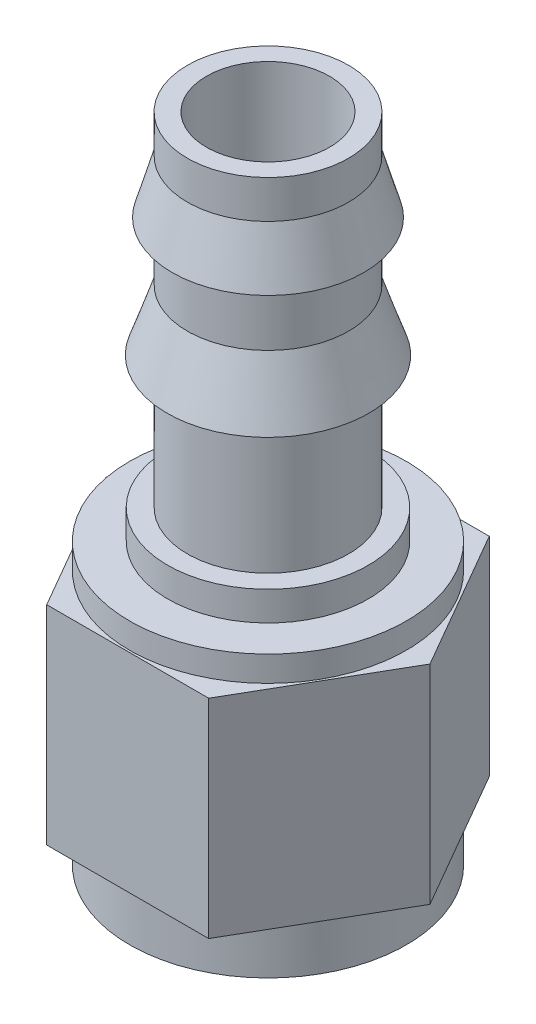
ISO-10303-21;
HEADER;
FILE_DESCRIPTION(('STEP AP214'),'2;1');
FILE_NAME('part.step','',(''),(''),'','','');
FILE_SCHEMA(('AUTOMOTIVE_DESIGN { 1 0 10303 214 1 1 1 1 }'));
ENDSEC;
DATA;
#1=APPLICATION_CONTEXT('core data for automotive mechanical design processes');
#2=APPLICATION_PROTOCOL_DEFINITION('international standard','automotive_design',2000,#1);
#3=PRODUCT_CONTEXT('',#1,'mechanical');
#4=PRODUCT('Part','Part','',(#3));
#5=PRODUCT_RELATED_PRODUCT_CATEGORY('part','',(#4));
#6=PRODUCT_DEFINITION_FORMATION('','',#4);
#7=PRODUCT_DEFINITION_CONTEXT('part definition',#1,'design');
#8=PRODUCT_DEFINITION('design','',#6,#7);
#9=PRODUCT_DEFINITION_SHAPE('','',#8);
#10=(LENGTH_UNIT() NAMED_UNIT(*) SI_UNIT(.MILLI.,.METRE.));
#11=(NAMED_UNIT(*) PLANE_ANGLE_UNIT() SI_UNIT($,.RADIAN.));
#12=(NAMED_UNIT(*) SI_UNIT($,.STERADIAN.) SOLID_ANGLE_UNIT());
#13=UNCERTAINTY_MEASURE_WITH_UNIT(LENGTH_MEASURE(1.E-05),#10,'distance_accuracy_value','');
#14=(GEOMETRIC_REPRESENTATION_CONTEXT(3) GLOBAL_UNCERTAINTY_ASSIGNED_CONTEXT((#13)) GLOBAL_UNIT_ASSIGNED_CONTEXT((#10,
#11,#12)) REPRESENTATION_CONTEXT('',''));
#15=CARTESIAN_POINT('',(0.,0.,0.));
#16=DIRECTION('',(0.,0.,1.));
#17=DIRECTION('',(1.,0.,0.));
#18=AXIS2_PLACEMENT_3D('',#15,#16,#17);
#19=CARTESIAN_POINT('',(11.05,20.1,0.));
#20=DIRECTION('',(0.,-1.,0.));
#21=DIRECTION('',(1.,0.,0.));
#22=AXIS2_PLACEMENT_3D('',#19,#20,#21);
#23=PLANE('',#22);
#24=CARTESIAN_POINT('',(0.,20.1,0.));
#25=DIRECTION('',(0.,1.,0.));
#26=DIRECTION('',(-1.,0.,0.));
#27=AXIS2_PLACEMENT_3D('',#24,#25,#26);
#28=CIRCLE('',#27,10.9);
#29=CARTESIAN_POINT('',(-10.9,20.1,0.));
#30=VERTEX_POINT('',#29);
#31=EDGE_CURVE('E179',#30,#30,#28,.T.);
#32=ORIENTED_EDGE('',*,*,#31,.F.);
#33=EDGE_LOOP('',(#32));
#34=FACE_BOUND('',#33,.T.);
#35=DIRECTION('',(0.499999999999995,0.,-0.866025403784442));
#36=VECTOR('',#35,1.);
#37=CARTESIAN_POINT('',(6.38090693661316,20.1,11.0520550125824));
#38=LINE('',#37,#36);
#39=CARTESIAN_POINT('',(6.38090693661316,20.1,11.0520550125824));
#40=VERTEX_POINT('',#39);
#41=CARTESIAN_POINT('',(12.7618138732261,20.1,0.));
#42=VERTEX_POINT('',#41);
#43=EDGE_CURVE('E123',#40,#42,#38,.T.);
#44=ORIENTED_EDGE('',*,*,#43,.T.);
#45=DIRECTION('',(-0.500000000000001,0.,-0.866025403784438));
#46=VECTOR('',#45,1.);
#47=CARTESIAN_POINT('',(12.7618138732261,20.1,0.));
#48=LINE('',#47,#46);
#49=CARTESIAN_POINT('',(6.380906936613,20.1,-11.0520550125825));
#50=VERTEX_POINT('',#49);
#51=EDGE_CURVE('E126',#42,#50,#48,.T.);
#52=ORIENTED_EDGE('',*,*,#51,.T.);
#53=DIRECTION('',(-1.,0.,0.));
#54=VECTOR('',#53,1.);
#55=CARTESIAN_POINT('',(6.380906936613,20.1,-11.0520550125825));
#56=LINE('',#55,#54);
#57=CARTESIAN_POINT('',(-6.38090693661308,20.1,-11.0520550125824));
#58=VERTEX_POINT('',#57);
#59=EDGE_CURVE('E130',#50,#58,#56,.T.);
#60=ORIENTED_EDGE('',*,*,#59,.T.);
#61=DIRECTION('',(-0.499999999999995,0.,0.866025403784442));
#62=VECTOR('',#61,1.);
#63=CARTESIAN_POINT('',(-6.38090693661308,20.1,-11.0520550125824));
#64=LINE('',#63,#62);
#65=CARTESIAN_POINT('',(-12.7618138732261,20.1,0.));
#66=VERTEX_POINT('',#65);
#67=EDGE_CURVE('E133',#58,#66,#64,.T.);
#68=ORIENTED_EDGE('',*,*,#67,.T.);
#69=DIRECTION('',(0.500000000000007,0.,0.866025403784435));
#70=VECTOR('',#69,1.);
#71=CARTESIAN_POINT('',(-12.7618138732261,20.1,0.));
#72=LINE('',#71,#70);
#73=CARTESIAN_POINT('',(-6.38090693661293,20.1,11.0520550125825));
#74=VERTEX_POINT('',#73);
#75=EDGE_CURVE('E99',#66,#74,#72,.T.);
#76=ORIENTED_EDGE('',*,*,#75,.T.);
#77=DIRECTION('',(1.,0.,0.));
#78=VECTOR('',#77,1.);
#79=CARTESIAN_POINT('',(-6.38090693661293,20.1,11.0520550125825));
#80=LINE('',#79,#78);
#81=EDGE_CURVE('E136',#74,#40,#80,.T.);
#82=ORIENTED_EDGE('',*,*,#81,.T.);
#83=EDGE_LOOP('',(#44,#52,#60,#68,#76,#82));
#84=FACE_BOUND('',#83,.T.);
#85=ADVANCED_FACE('F34',(#34,#84),#23,.F.);
#86=CARTESIAN_POINT('',(0.,51.4,0.));
#87=DIRECTION('',(0.,1.,0.));
#88=DIRECTION('',(-1.,0.,0.));
#89=AXIS2_PLACEMENT_3D('',#86,#87,#88);
#90=CYLINDRICAL_SURFACE('',#89,10.9);
#91=CARTESIAN_POINT('',(0.,22.1,0.));
#92=DIRECTION('',(0.,1.,0.));
#93=DIRECTION('',(-1.,0.,0.));
#94=AXIS2_PLACEMENT_3D('',#91,#92,#93);
#95=CIRCLE('',#94,10.9);
#96=CARTESIAN_POINT('',(-10.9,22.1,0.));
#97=VERTEX_POINT('',#96);
#98=EDGE_CURVE('E176',#97,#97,#95,.T.);
#99=ORIENTED_EDGE('',*,*,#98,.F.);
#100=EDGE_LOOP('',(#99));
#101=FACE_BOUND('',#100,.T.);
#102=ORIENTED_EDGE('',*,*,#31,.T.);
#103=EDGE_LOOP('',(#102));
#104=FACE_BOUND('',#103,.T.);
#105=ADVANCED_FACE('F199',(#101,#104),#90,.T.);
#106=CARTESIAN_POINT('',(10.9,22.1,0.));
#107=DIRECTION('',(0.,-1.,0.));
#108=DIRECTION('',(1.,0.,0.));
#109=AXIS2_PLACEMENT_3D('',#106,#107,#108);
#110=PLANE('',#109);
#111=CARTESIAN_POINT('',(0.,22.1,0.));
#112=DIRECTION('',(0.,1.,0.));
#113=DIRECTION('',(-1.,0.,0.));
#114=AXIS2_PLACEMENT_3D('',#111,#112,#113);
#115=CIRCLE('',#114,7.9);
#116=CARTESIAN_POINT('',(-7.9,22.1,0.));
#117=VERTEX_POINT('',#116);
#118=EDGE_CURVE('E173',#117,#117,#115,.T.);
#119=ORIENTED_EDGE('',*,*,#118,.F.);
#120=EDGE_LOOP('',(#119));
#121=FACE_BOUND('',#120,.T.);
#122=ORIENTED_EDGE('',*,*,#98,.T.);
#123=EDGE_LOOP('',(#122));
#124=FACE_BOUND('',#123,.T.);
#125=ADVANCED_FACE('F205',(#121,#124),#110,.F.);
#126=CARTESIAN_POINT('',(0.,51.4,0.));
#127=DIRECTION('',(0.,1.,0.));
#128=DIRECTION('',(-1.,0.,0.));
#129=AXIS2_PLACEMENT_3D('',#126,#127,#128);
#130=CYLINDRICAL_SURFACE('',#129,7.9);
#131=CARTESIAN_POINT('',(0.,24.4,0.));
#132=DIRECTION('',(0.,1.,0.));
#133=DIRECTION('',(-1.,0.,0.));
#134=AXIS2_PLACEMENT_3D('',#131,#132,#133);
#135=CIRCLE('',#134,7.9);
#136=CARTESIAN_POINT('',(-7.9,24.4,0.));
#137=VERTEX_POINT('',#136);
#138=EDGE_CURVE('E170',#137,#137,#135,.T.);
#139=ORIENTED_EDGE('',*,*,#138,.F.);
#140=EDGE_LOOP('',(#139));
#141=FACE_BOUND('',#140,.T.);
#142=ORIENTED_EDGE('',*,*,#118,.T.);
#143=EDGE_LOOP('',(#142));
#144=FACE_BOUND('',#143,.T.);
#145=ADVANCED_FACE('F213',(#141,#144),#130,.T.);
#146=CARTESIAN_POINT('',(7.9,24.4,0.));
#147=DIRECTION('',(0.,-1.,0.));
#148=DIRECTION('',(1.,0.,0.));
#149=AXIS2_PLACEMENT_3D('',#146,#147,#148);
#150=PLANE('',#149);
#151=CARTESIAN_POINT('',(0.,24.4,0.));
#152=DIRECTION('',(0.,1.,0.));
#153=DIRECTION('',(-1.,0.,0.));
#154=AXIS2_PLACEMENT_3D('',#151,#152,#153);
#155=CIRCLE('',#154,6.35);
#156=CARTESIAN_POINT('',(-6.35,24.4,0.));
#157=VERTEX_POINT('',#156);
#158=EDGE_CURVE('E167',#157,#157,#155,.T.);
#159=ORIENTED_EDGE('',*,*,#158,.F.);
#160=EDGE_LOOP('',(#159));
#161=FACE_BOUND('',#160,.T.);
#162=ORIENTED_EDGE('',*,*,#138,.T.);
#163=EDGE_LOOP('',(#162));
#164=FACE_BOUND('',#163,.T.);
#165=ADVANCED_FACE('F217',(#161,#164),#150,.F.);
#166=CARTESIAN_POINT('',(0.,51.4,0.));
#167=DIRECTION('',(0.,1.,0.));
#168=DIRECTION('',(-1.,0.,0.));
#169=AXIS2_PLACEMENT_3D('',#166,#167,#168);
#170=CYLINDRICAL_SURFACE('',#169,6.35);
#171=CARTESIAN_POINT('',(0.,34.8,0.));
#172=DIRECTION('',(0.,1.,0.));
#173=DIRECTION('',(-1.,0.,0.));
#174=AXIS2_PLACEMENT_3D('',#171,#172,#173);
#175=CIRCLE('',#174,6.35);
#176=CARTESIAN_POINT('',(-6.35,34.8,0.));
#177=VERTEX_POINT('',#176);
#178=EDGE_CURVE('E164',#177,#177,#175,.T.);
#179=ORIENTED_EDGE('',*,*,#178,.F.);
#180=EDGE_LOOP('',(#179));
#181=FACE_BOUND('',#180,.T.);
#182=ORIENTED_EDGE('',*,*,#158,.T.);
#183=EDGE_LOOP('',(#182));
#184=FACE_BOUND('',#183,.T.);
#185=ADVANCED_FACE('F221',(#181,#184),#170,.T.);
#186=CARTESIAN_POINT('',(6.35,34.8,0.));
#187=DIRECTION('',(0.,1.,0.));
#188=DIRECTION('',(-1.,0.,0.));
#189=AXIS2_PLACEMENT_3D('',#186,#187,#188);
#190=PLANE('',#189);
#191=CARTESIAN_POINT('',(0.,34.8,0.));
#192=DIRECTION('',(0.,1.,0.));
#193=DIRECTION('',(-1.,0.,0.));
#194=AXIS2_PLACEMENT_3D('',#191,#192,#193);
#195=CIRCLE('',#194,7.95);
#196=CARTESIAN_POINT('',(-7.95,34.8,0.));
#197=VERTEX_POINT('',#196);
#198=EDGE_CURVE('E161',#197,#197,#195,.T.);
#199=ORIENTED_EDGE('',*,*,#198,.F.);
#200=EDGE_LOOP('',(#199));
#201=FACE_BOUND('',#200,.T.);
#202=ORIENTED_EDGE('',*,*,#178,.T.);
#203=EDGE_LOOP('',(#202));
#204=FACE_BOUND('',#203,.T.);
#205=ADVANCED_FACE('F225',(#201,#204),#190,.F.);
#206=CARTESIAN_POINT('',(0.,34.8,0.));
#207=DIRECTION('',(0.,-1.,0.));
#208=DIRECTION('',(1.,0.,0.));
#209=AXIS2_PLACEMENT_3D('',#206,#207,#208);
#210=CONICAL_SURFACE('',#209,7.95,0.321750554396642);
#211=CARTESIAN_POINT('',(0.,39.6,0.));
#212=DIRECTION('',(0.,1.,0.));
#213=DIRECTION('',(-1.,0.,0.));
#214=AXIS2_PLACEMENT_3D('',#211,#212,#213);
#215=CIRCLE('',#214,6.35);
#216=CARTESIAN_POINT('',(-6.35,39.6,0.));
#217=VERTEX_POINT('',#216);
#218=EDGE_CURVE('E158',#217,#217,#215,.T.);
#219=ORIENTED_EDGE('',*,*,#218,.F.);
#220=EDGE_LOOP('',(#219));
#221=FACE_BOUND('',#220,.T.);
#222=ORIENTED_EDGE('',*,*,#198,.T.);
#223=EDGE_LOOP('',(#222));
#224=FACE_BOUND('',#223,.T.);
#225=ADVANCED_FACE('F229',(#221,#224),#210,.T.);
#226=CARTESIAN_POINT('',(0.,51.4,0.));
#227=DIRECTION('',(0.,1.,0.));
#228=DIRECTION('',(-1.,0.,0.));
#229=AXIS2_PLACEMENT_3D('',#226,#227,#228);
#230=CYLINDRICAL_SURFACE('',#229,6.35);
#231=CARTESIAN_POINT('',(0.,44.2,0.));
#232=DIRECTION('',(0.,1.,0.));
#233=DIRECTION('',(-1.,0.,0.));
#234=AXIS2_PLACEMENT_3D('',#231,#232,#233);
#235=CIRCLE('',#234,6.35);
#236=CARTESIAN_POINT('',(-6.35,44.2,0.));
#237=VERTEX_POINT('',#236);
#238=EDGE_CURVE('E155',#237,#237,#235,.T.);
#239=ORIENTED_EDGE('',*,*,#238,.F.);
#240=EDGE_LOOP('',(#239));
#241=FACE_BOUND('',#240,.T.);
#242=ORIENTED_EDGE('',*,*,#218,.T.);
#243=EDGE_LOOP('',(#242));
#244=FACE_BOUND('',#243,.T.);
#245=ADVANCED_FACE('F233',(#241,#244),#230,.T.);
#246=CARTESIAN_POINT('',(6.35,44.2,0.));
#247=DIRECTION('',(0.,1.,0.));
#248=DIRECTION('',(-1.,0.,0.));
#249=AXIS2_PLACEMENT_3D('',#246,#247,#248);
#250=PLANE('',#249);
#251=CARTESIAN_POINT('',(0.,44.2,0.));
#252=DIRECTION('',(0.,1.,0.));
#253=DIRECTION('',(-1.,0.,0.));
#254=AXIS2_PLACEMENT_3D('',#251,#252,#253);
#255=CIRCLE('',#254,7.55);
#256=CARTESIAN_POINT('',(-7.55,44.2,0.));
#257=VERTEX_POINT('',#256);
#258=EDGE_CURVE('E152',#257,#257,#255,.T.);
#259=ORIENTED_EDGE('',*,*,#258,.F.);
#260=EDGE_LOOP('',(#259));
#261=FACE_BOUND('',#260,.T.);
#262=ORIENTED_EDGE('',*,*,#238,.T.);
#263=EDGE_LOOP('',(#262));
#264=FACE_BOUND('',#263,.T.);
#265=ADVANCED_FACE('F237',(#261,#264),#250,.F.);
#266=CARTESIAN_POINT('',(0.,44.2,0.));
#267=DIRECTION('',(0.,-1.,0.));
#268=DIRECTION('',(1.,0.,0.));
#269=AXIS2_PLACEMENT_3D('',#266,#267,#268);
#270=CONICAL_SURFACE('',#269,7.55,0.278299659005111);
#271=CARTESIAN_POINT('',(0.,48.4,0.));
#272=DIRECTION('',(0.,1.,0.));
#273=DIRECTION('',(-1.,0.,0.));
#274=AXIS2_PLACEMENT_3D('',#271,#272,#273);
#275=CIRCLE('',#274,6.35);
#276=CARTESIAN_POINT('',(-6.35,48.4,0.));
#277=VERTEX_POINT('',#276);
#278=EDGE_CURVE('E149',#277,#277,#275,.T.);
#279=ORIENTED_EDGE('',*,*,#278,.F.);
#280=EDGE_LOOP('',(#279));
#281=FACE_BOUND('',#280,.T.);
#282=ORIENTED_EDGE('',*,*,#258,.T.);
#283=EDGE_LOOP('',(#282));
#284=FACE_BOUND('',#283,.T.);
#285=ADVANCED_FACE('F241',(#281,#284),#270,.T.);
#286=CARTESIAN_POINT('',(0.,51.4,0.));
#287=DIRECTION('',(0.,1.,0.));
#288=DIRECTION('',(-1.,0.,0.));
#289=AXIS2_PLACEMENT_3D('',#286,#287,#288);
#290=CYLINDRICAL_SURFACE('',#289,6.35);
#291=CARTESIAN_POINT('',(0.,51.4,0.));
#292=DIRECTION('',(0.,1.,0.));
#293=DIRECTION('',(-1.,0.,0.));
#294=AXIS2_PLACEMENT_3D('',#291,#292,#293);
#295=CIRCLE('',#294,6.35);
#296=CARTESIAN_POINT('',(-6.35,51.4,0.));
#297=VERTEX_POINT('',#296);
#298=EDGE_CURVE('E141',#297,#297,#295,.T.);
#299=ORIENTED_EDGE('',*,*,#298,.F.);
#300=EDGE_LOOP('',(#299));
#301=FACE_BOUND('',#300,.T.);
#302=ORIENTED_EDGE('',*,*,#278,.T.);
#303=EDGE_LOOP('',(#302));
#304=FACE_BOUND('',#303,.T.);
#305=ADVANCED_FACE('F245',(#301,#304),#290,.T.);
#306=CARTESIAN_POINT('',(0.,51.4,0.));
#307=DIRECTION('',(0.,-1.,0.));
#308=DIRECTION('',(1.,0.,0.));
#309=AXIS2_PLACEMENT_3D('',#306,#307,#308);
#310=PLANE('',#309);
#311=CARTESIAN_POINT('',(0.,51.4,0.));
#312=DIRECTION('',(0.,1.,0.));
#313=DIRECTION('',(-1.,0.,0.));
#314=AXIS2_PLACEMENT_3D('',#311,#312,#313);
#315=CIRCLE('',#314,4.85);
#316=CARTESIAN_POINT('',(-4.85,51.4,0.));
#317=VERTEX_POINT('',#316);
#318=EDGE_CURVE('E277',#317,#317,#315,.T.);
#319=ORIENTED_EDGE('',*,*,#318,.F.);
#320=EDGE_LOOP('',(#319));
#321=FACE_BOUND('',#320,.T.);
#322=ORIENTED_EDGE('',*,*,#298,.T.);
#323=EDGE_LOOP('',(#322));
#324=FACE_BOUND('',#323,.T.);
#325=ADVANCED_FACE('F249',(#321,#324),#310,.F.);
#326=CARTESIAN_POINT('',(0.,3.69999999999999,0.));
#327=DIRECTION('',(0.,1.,0.));
#328=DIRECTION('',(0.,0.,1.));
#329=AXIS2_PLACEMENT_3D('',#326,#327,#328);
#330=PLANE('',#329);
#331=DIRECTION('',(0.499999999999995,0.,-0.866025403784442));
#332=VECTOR('',#331,1.);
#333=CARTESIAN_POINT('',(6.38090693661316,3.69999999999999,11.0520550125824));
#334=LINE('',#333,#332);
#335=CARTESIAN_POINT('',(6.38090693661316,3.69999999999999,11.0520550125824));
#336=VERTEX_POINT('',#335);
#337=CARTESIAN_POINT('',(12.7618138732261,3.69999999999999,0.));
#338=VERTEX_POINT('',#337);
#339=EDGE_CURVE('E139',#336,#338,#334,.T.);
#340=ORIENTED_EDGE('',*,*,#339,.F.);
#341=DIRECTION('',(1.,0.,0.));
#342=VECTOR('',#341,1.);
#343=CARTESIAN_POINT('',(-6.38090693661293,3.69999999999999,11.0520550125825));
#344=LINE('',#343,#342);
#345=CARTESIAN_POINT('',(-6.38090693661293,3.69999999999999,11.0520550125825));
#346=VERTEX_POINT('',#345);
#347=EDGE_CURVE('E113',#346,#336,#344,.T.);
#348=ORIENTED_EDGE('',*,*,#347,.F.);
#349=DIRECTION('',(0.500000000000007,0.,0.866025403784435));
#350=VECTOR('',#349,1.);
#351=CARTESIAN_POINT('',(-12.7618138732261,3.69999999999999,0.));
#352=LINE('',#351,#350);
#353=CARTESIAN_POINT('',(-12.7618138732261,3.69999999999999,0.));
#354=VERTEX_POINT('',#353);
#355=EDGE_CURVE('E97',#354,#346,#352,.T.);
#356=ORIENTED_EDGE('',*,*,#355,.F.);
#357=DIRECTION('',(-0.499999999999995,0.,0.866025403784442));
#358=VECTOR('',#357,1.);
#359=CARTESIAN_POINT('',(-6.38090693661308,3.69999999999999,-11.0520550125824));
#360=LINE('',#359,#358);
#361=CARTESIAN_POINT('',(-6.38090693661308,3.69999999999999,-11.0520550125824));
#362=VERTEX_POINT('',#361);
#363=EDGE_CURVE('E111',#362,#354,#360,.T.);
#364=ORIENTED_EDGE('',*,*,#363,.F.);
#365=DIRECTION('',(-1.,0.,0.));
#366=VECTOR('',#365,1.);
#367=CARTESIAN_POINT('',(6.380906936613,3.69999999999999,-11.0520550125825));
#368=LINE('',#367,#366);
#369=CARTESIAN_POINT('',(6.380906936613,3.69999999999999,-11.0520550125825));
#370=VERTEX_POINT('',#369);
#371=EDGE_CURVE('E116',#370,#362,#368,.T.);
#372=ORIENTED_EDGE('',*,*,#371,.F.);
#373=DIRECTION('',(-0.500000000000001,0.,-0.866025403784438));
#374=VECTOR('',#373,1.);
#375=CARTESIAN_POINT('',(12.7618138732261,3.69999999999999,0.));
#376=LINE('',#375,#374);
#377=EDGE_CURVE('E118',#338,#370,#376,.T.);
#378=ORIENTED_EDGE('',*,*,#377,.F.);
#379=EDGE_LOOP('',(#340,#348,#356,#364,#372,#378));
#380=FACE_BOUND('',#379,.T.);
#381=CARTESIAN_POINT('',(0.,3.69999999999999,0.));
#382=DIRECTION('',(0.,1.,0.));
#383=DIRECTION('',(0.,0.,1.));
#384=AXIS2_PLACEMENT_3D('',#381,#382,#383);
#385=CIRCLE('',#384,10.9);
#386=CARTESIAN_POINT('',(0.,3.69999999999999,10.9));
#387=VERTEX_POINT('',#386);
#388=EDGE_CURVE('E11',#387,#387,#385,.T.);
#389=ORIENTED_EDGE('',*,*,#388,.T.);
#390=EDGE_LOOP('',(#389));
#391=FACE_BOUND('',#390,.T.);
#392=ADVANCED_FACE('F108',(#380,#391),#330,.F.);
#393=CARTESIAN_POINT('',(6.38090693661316,3.69999999999999,11.0520550125824));
#394=DIRECTION('',(0.866025403784442,0.,0.499999999999995));
#395=DIRECTION('',(0.499999999999995,0.,-0.866025403784442));
#396=AXIS2_PLACEMENT_3D('',#393,#394,#395);
#397=PLANE('',#396);
#398=ORIENTED_EDGE('',*,*,#43,.F.);
#399=DIRECTION('',(0.,1.,0.));
#400=VECTOR('',#399,1.);
#401=CARTESIAN_POINT('',(6.38090693661316,3.69999999999999,11.0520550125824));
#402=LINE('',#401,#400);
#403=EDGE_CURVE('E51',#336,#40,#402,.T.);
#404=ORIENTED_EDGE('',*,*,#403,.F.);
#405=ORIENTED_EDGE('',*,*,#339,.T.);
#406=DIRECTION('',(0.,1.,0.));
#407=VECTOR('',#406,1.);
#408=CARTESIAN_POINT('',(12.7618138732261,3.69999999999999,0.));
#409=LINE('',#408,#407);
#410=EDGE_CURVE('E86',#338,#42,#409,.T.);
#411=ORIENTED_EDGE('',*,*,#410,.T.);
#412=EDGE_LOOP('',(#398,#404,#405,#411));
#413=FACE_BOUND('',#412,.T.);
#414=ADVANCED_FACE('F254',(#413),#397,.T.);
#415=CARTESIAN_POINT('',(-6.38090693661293,3.69999999999999,11.0520550125825));
#416=DIRECTION('',(0.,0.,1.));
#417=DIRECTION('',(1.,0.,0.));
#418=AXIS2_PLACEMENT_3D('',#415,#416,#417);
#419=PLANE('',#418);
#420=ORIENTED_EDGE('',*,*,#81,.F.);
#421=DIRECTION('',(0.,1.,0.));
#422=VECTOR('',#421,1.);
#423=CARTESIAN_POINT('',(-6.38090693661293,3.69999999999999,11.0520550125825));
#424=LINE('',#423,#422);
#425=EDGE_CURVE('E74',#346,#74,#424,.T.);
#426=ORIENTED_EDGE('',*,*,#425,.F.);
#427=ORIENTED_EDGE('',*,*,#347,.T.);
#428=ORIENTED_EDGE('',*,*,#403,.T.);
#429=EDGE_LOOP('',(#420,#426,#427,#428));
#430=FACE_BOUND('',#429,.T.);
#431=ADVANCED_FACE('F256',(#430),#419,.T.);
#432=CARTESIAN_POINT('',(-12.7618138732261,3.69999999999999,0.));
#433=DIRECTION('',(-0.866025403784435,0.,0.500000000000007));
#434=DIRECTION('',(0.500000000000007,0.,0.866025403784435));
#435=AXIS2_PLACEMENT_3D('',#432,#433,#434);
#436=PLANE('',#435);
#437=ORIENTED_EDGE('',*,*,#75,.F.);
#438=DIRECTION('',(0.,1.,0.));
#439=VECTOR('',#438,1.);
#440=CARTESIAN_POINT('',(-12.7618138732261,3.69999999999999,0.));
#441=LINE('',#440,#439);
#442=EDGE_CURVE('E94',#354,#66,#441,.T.);
#443=ORIENTED_EDGE('',*,*,#442,.F.);
#444=ORIENTED_EDGE('',*,*,#355,.T.);
#445=ORIENTED_EDGE('',*,*,#425,.T.);
#446=EDGE_LOOP('',(#437,#443,#444,#445));
#447=FACE_BOUND('',#446,.T.);
#448=ADVANCED_FACE('F96',(#447),#436,.T.);
#449=CARTESIAN_POINT('',(-6.38090693661308,3.69999999999999,-11.0520550125824));
#450=DIRECTION('',(-0.866025403784441,0.,-0.499999999999995));
#451=DIRECTION('',(-0.499999999999995,0.,0.866025403784442));
#452=AXIS2_PLACEMENT_3D('',#449,#450,#451);
#453=PLANE('',#452);
#454=ORIENTED_EDGE('',*,*,#67,.F.);
#455=DIRECTION('',(0.,1.,0.));
#456=VECTOR('',#455,1.);
#457=CARTESIAN_POINT('',(-6.38090693661308,3.69999999999999,-11.0520550125824));
#458=LINE('',#457,#456);
#459=EDGE_CURVE('E104',#362,#58,#458,.T.);
#460=ORIENTED_EDGE('',*,*,#459,.F.);
#461=ORIENTED_EDGE('',*,*,#363,.T.);
#462=ORIENTED_EDGE('',*,*,#442,.T.);
#463=EDGE_LOOP('',(#454,#460,#461,#462));
#464=FACE_BOUND('',#463,.T.);
#465=ADVANCED_FACE('F115',(#464),#453,.T.);
#466=CARTESIAN_POINT('',(6.380906936613,3.69999999999999,-11.0520550125825));
#467=DIRECTION('',(0.,0.,-1.));
#468=DIRECTION('',(-1.,0.,0.));
#469=AXIS2_PLACEMENT_3D('',#466,#467,#468);
#470=PLANE('',#469);
#471=ORIENTED_EDGE('',*,*,#59,.F.);
#472=DIRECTION('',(0.,1.,0.));
#473=VECTOR('',#472,1.);
#474=CARTESIAN_POINT('',(6.380906936613,3.69999999999999,-11.0520550125825));
#475=LINE('',#474,#473);
#476=EDGE_CURVE('E144',#370,#50,#475,.T.);
#477=ORIENTED_EDGE('',*,*,#476,.F.);
#478=ORIENTED_EDGE('',*,*,#371,.T.);
#479=ORIENTED_EDGE('',*,*,#459,.T.);
#480=EDGE_LOOP('',(#471,#477,#478,#479));
#481=FACE_BOUND('',#480,.T.);
#482=ADVANCED_FACE('F195',(#481),#470,.T.);
#483=CARTESIAN_POINT('',(12.7618138732261,3.69999999999999,0.));
#484=DIRECTION('',(0.866025403784438,0.,-0.500000000000001));
#485=DIRECTION('',(-0.500000000000001,0.,-0.866025403784438));
#486=AXIS2_PLACEMENT_3D('',#483,#484,#485);
#487=PLANE('',#486);
#488=ORIENTED_EDGE('',*,*,#51,.F.);
#489=ORIENTED_EDGE('',*,*,#410,.F.);
#490=ORIENTED_EDGE('',*,*,#377,.T.);
#491=ORIENTED_EDGE('',*,*,#476,.T.);
#492=EDGE_LOOP('',(#488,#489,#490,#491));
#493=FACE_BOUND('',#492,.T.);
#494=ADVANCED_FACE('F188',(#493),#487,.T.);
#495=CARTESIAN_POINT('',(0.,0.,0.));
#496=DIRECTION('',(0.,1.,0.));
#497=DIRECTION('',(-1.,0.,0.));
#498=AXIS2_PLACEMENT_3D('',#495,#496,#497);
#499=PLANE('',#498);
#500=CARTESIAN_POINT('',(0.,0.,0.));
#501=DIRECTION('',(0.,1.,0.));
#502=DIRECTION('',(-1.,0.,0.));
#503=AXIS2_PLACEMENT_3D('',#500,#501,#502);
#504=CIRCLE('',#503,4.85);
#505=CARTESIAN_POINT('',(-4.85,0.,0.));
#506=VERTEX_POINT('',#505);
#507=EDGE_CURVE('E127',#506,#506,#504,.T.);
#508=ORIENTED_EDGE('',*,*,#507,.T.);
#509=EDGE_LOOP('',(#508));
#510=FACE_BOUND('',#509,.T.);
#511=CARTESIAN_POINT('',(0.,0.,0.));
#512=DIRECTION('',(0.,1.,0.));
#513=DIRECTION('',(-1.,0.,0.));
#514=AXIS2_PLACEMENT_3D('',#511,#512,#513);
#515=CIRCLE('',#514,10.9);
#516=CARTESIAN_POINT('',(-10.9,0.,0.));
#517=VERTEX_POINT('',#516);
#518=EDGE_CURVE('E43',#517,#517,#515,.T.);
#519=ORIENTED_EDGE('',*,*,#518,.F.);
#520=EDGE_LOOP('',(#519));
#521=FACE_BOUND('',#520,.T.);
#522=ADVANCED_FACE('F36',(#510,#521),#499,.F.);
#523=CARTESIAN_POINT('',(0.,51.4,0.));
#524=DIRECTION('',(0.,1.,0.));
#525=DIRECTION('',(-1.,0.,0.));
#526=AXIS2_PLACEMENT_3D('',#523,#524,#525);
#527=CYLINDRICAL_SURFACE('',#526,10.9);
#528=ORIENTED_EDGE('',*,*,#518,.T.);
#529=EDGE_LOOP('',(#528));
#530=FACE_BOUND('',#529,.T.);
#531=ORIENTED_EDGE('',*,*,#388,.F.);
#532=EDGE_LOOP('',(#531));
#533=FACE_BOUND('',#532,.T.);
#534=ADVANCED_FACE('F184',(#530,#533),#527,.T.);
#535=CARTESIAN_POINT('',(0.,0.,0.));
#536=DIRECTION('',(0.,1.,0.));
#537=DIRECTION('',(-1.,0.,0.));
#538=AXIS2_PLACEMENT_3D('',#535,#536,#537);
#539=CYLINDRICAL_SURFACE('',#538,4.85);
#540=CARTESIAN_POINT('',(-4.85,0.,0.));
#541=CARTESIAN_POINT('',(-4.85,0.535416666666667,0.));
#542=CARTESIAN_POINT('',(-4.85,1.07083333333333,0.));
#543=CARTESIAN_POINT('',(-4.85,2.14166666666667,0.));
#544=CARTESIAN_POINT('',(-4.85,2.67708333333333,0.));
#545=CARTESIAN_POINT('',(-4.85,3.74791666666667,0.));
#546=CARTESIAN_POINT('',(-4.85,4.28333333333333,0.));
#547=CARTESIAN_POINT('',(-4.85,5.35416666666667,0.));
#548=CARTESIAN_POINT('',(-4.85,5.88958333333333,0.));
#549=CARTESIAN_POINT('',(-4.85,6.96041666666667,0.));
#550=CARTESIAN_POINT('',(-4.85,7.49583333333333,0.));
#551=CARTESIAN_POINT('',(-4.85,8.56666666666666,0.));
#552=CARTESIAN_POINT('',(-4.85,9.10208333333333,0.));
#553=CARTESIAN_POINT('',(-4.85,10.1729166666667,0.));
#554=CARTESIAN_POINT('',(-4.85,10.7083333333333,0.));
#555=CARTESIAN_POINT('',(-4.85,11.7791666666667,0.));
#556=CARTESIAN_POINT('',(-4.85,12.3145833333333,0.));
#557=CARTESIAN_POINT('',(-4.85,13.3854166666667,0.));
#558=CARTESIAN_POINT('',(-4.85,13.9208333333333,0.));
#559=CARTESIAN_POINT('',(-4.85,14.9916666666667,0.));
#560=CARTESIAN_POINT('',(-4.85,15.5270833333333,0.));
#561=CARTESIAN_POINT('',(-4.85,16.5979166666667,0.));
#562=CARTESIAN_POINT('',(-4.85,17.1333333333333,0.));
#563=CARTESIAN_POINT('',(-4.85,18.2041666666667,0.));
#564=CARTESIAN_POINT('',(-4.85,18.7395833333333,0.));
#565=CARTESIAN_POINT('',(-4.85,19.8104166666667,0.));
#566=CARTESIAN_POINT('',(-4.85,20.3458333333333,0.));
#567=CARTESIAN_POINT('',(-4.85,21.4166666666667,0.));
#568=CARTESIAN_POINT('',(-4.85,21.9520833333333,0.));
#569=CARTESIAN_POINT('',(-4.85,23.0229166666667,0.));
#570=CARTESIAN_POINT('',(-4.85,23.5583333333333,0.));
#571=CARTESIAN_POINT('',(-4.85,24.6291666666667,0.));
#572=CARTESIAN_POINT('',(-4.85,25.1645833333333,0.));
#573=CARTESIAN_POINT('',(-4.85,26.2354166666667,0.));
#574=CARTESIAN_POINT('',(-4.85,26.7708333333333,0.));
#575=CARTESIAN_POINT('',(-4.85,27.8416666666667,0.));
#576=CARTESIAN_POINT('',(-4.85,28.3770833333333,0.));
#577=CARTESIAN_POINT('',(-4.85,29.4479166666667,0.));
#578=CARTESIAN_POINT('',(-4.85,29.9833333333333,0.));
#579=CARTESIAN_POINT('',(-4.85,31.0541666666667,0.));
#580=CARTESIAN_POINT('',(-4.85,31.5895833333333,0.));
#581=CARTESIAN_POINT('',(-4.85,32.6604166666667,0.));
#582=CARTESIAN_POINT('',(-4.85,33.1958333333333,0.));
#583=CARTESIAN_POINT('',(-4.85,34.2666666666667,0.));
#584=CARTESIAN_POINT('',(-4.85,34.8020833333333,0.));
#585=CARTESIAN_POINT('',(-4.85,35.8729166666667,0.));
#586=CARTESIAN_POINT('',(-4.85,36.4083333333333,0.));
#587=CARTESIAN_POINT('',(-4.85,37.4791666666667,0.));
#588=CARTESIAN_POINT('',(-4.85,38.0145833333333,0.));
#589=CARTESIAN_POINT('',(-4.85,39.0854166666667,0.));
#590=CARTESIAN_POINT('',(-4.85,39.6208333333333,0.));
#591=CARTESIAN_POINT('',(-4.85,40.6916666666667,0.));
#592=CARTESIAN_POINT('',(-4.85,41.2270833333333,0.));
#593=CARTESIAN_POINT('',(-4.85,42.2979166666667,0.));
#594=CARTESIAN_POINT('',(-4.85,42.8333333333333,0.));
#595=CARTESIAN_POINT('',(-4.85,43.9041666666667,0.));
#596=CARTESIAN_POINT('',(-4.85,44.4395833333333,0.));
#597=CARTESIAN_POINT('',(-4.85,45.5104166666667,0.));
#598=CARTESIAN_POINT('',(-4.85,46.0458333333333,0.));
#599=CARTESIAN_POINT('',(-4.85,47.1166666666667,0.));
#600=CARTESIAN_POINT('',(-4.85,47.6520833333333,0.));
#601=CARTESIAN_POINT('',(-4.85,48.7229166666667,0.));
#602=CARTESIAN_POINT('',(-4.85,49.2583333333333,0.));
#603=CARTESIAN_POINT('',(-4.85,50.3291666666667,0.));
#604=CARTESIAN_POINT('',(-4.85,50.8645833333333,0.));
#605=CARTESIAN_POINT('',(-4.85,51.4,0.));
#606=B_SPLINE_CURVE_WITH_KNOTS('',3,(#540,#541,#542,#543,#544,#545,#546,#547,#548,#549,#550,
#551,#552,#553,#554,#555,#556,#557,#558,#559,#560,#561,#562,#563,#564,#565,#566,#567,#568,#569,
#570,#571,#572,#573,#574,#575,#576,#577,#578,#579,#580,#581,#582,#583,#584,#585,#586,#587,#588,
#589,#590,#591,#592,#593,#594,#595,#596,#597,#598,#599,#600,#601,#602,#603,#604,#605),
.UNSPECIFIED.,.F.,.F.,(4,2,2,2,2,2,2,2,2,2,2,2,2,2,2,2,2,2,2,2,2,2,2,2,2,2,2,2,2,2,2,2,4),(0.,
1.60625,3.2125,4.81875,6.425,8.03125,9.6375,11.24375,12.85,14.45625,16.0625,17.66875,19.275,
20.88125,22.4875,24.09375,25.7,27.30625,28.9125,30.51875,32.125,33.73125,35.3375,36.94375,38.55,
40.15625,41.7625,43.36875,44.975,46.58125,48.1875,49.79375,51.4),.UNSPECIFIED.);
#607=EDGE_CURVE('BSEAM194',#506,#317,#606,.T.);
#608=ORIENTED_EDGE('',*,*,#507,.F.);
#609=ORIENTED_EDGE('',*,*,#318,.T.);
#610=ORIENTED_EDGE('',*,*,#607,.T.);
#611=ORIENTED_EDGE('',*,*,#607,.F.);
#612=EDGE_LOOP('',(#608,#610,#609,#611));
#613=FACE_BOUND('',#612,.T.);
#614=ADVANCED_FACE('F194',(#613),#539,.F.);
#615=CLOSED_SHELL('',(#85,#105,#125,#145,#165,#185,#205,#225,#245,#265,#285,#305,#325,#392,#414,
#431,#448,#465,#482,#494,#522,#534,#614));
#616=MANIFOLD_SOLID_BREP('B2',#615);
#617=ADVANCED_BREP_SHAPE_REPRESENTATION('',(#18,#616),#14);
#618=SHAPE_DEFINITION_REPRESENTATION(#9,#617);
ENDSEC;
END-ISO-10303-21;
